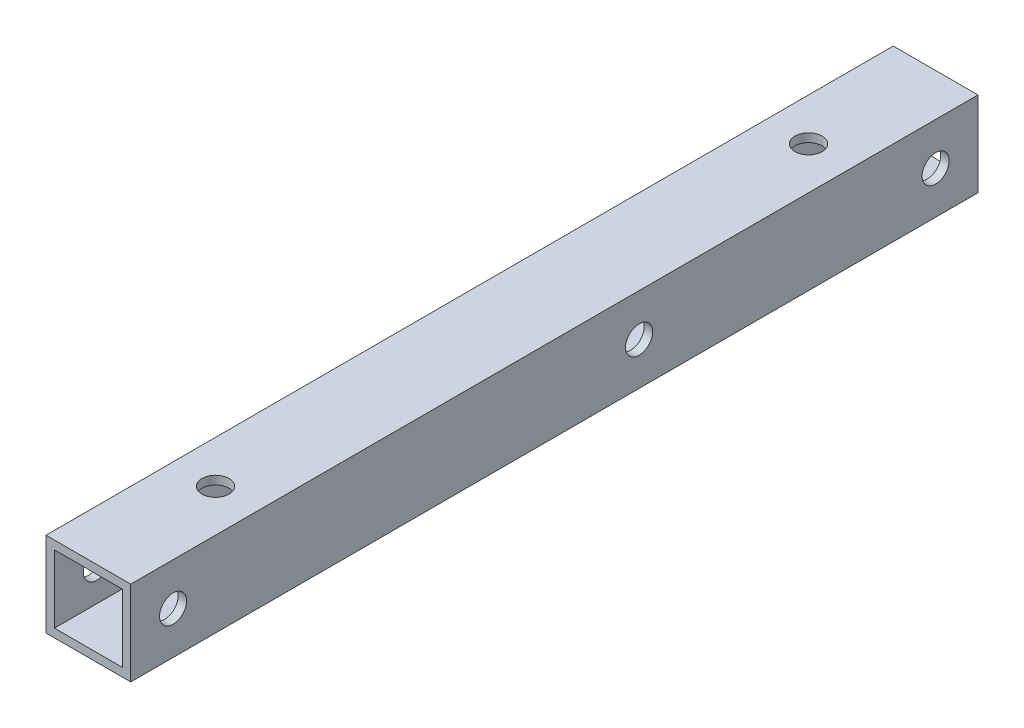
ISO-10303-21;
HEADER;
FILE_DESCRIPTION(('STEP AP214'),'2;1');
FILE_NAME('part.step','',(''),(''),'','','');
FILE_SCHEMA(('AUTOMOTIVE_DESIGN { 1 0 10303 214 1 1 1 1 }'));
ENDSEC;
DATA;
#1=APPLICATION_CONTEXT('core data for automotive mechanical design processes');
#2=APPLICATION_PROTOCOL_DEFINITION('international standard','automotive_design',2000,#1);
#3=PRODUCT_CONTEXT('',#1,'mechanical');
#4=PRODUCT('Part','Part','',(#3));
#5=PRODUCT_RELATED_PRODUCT_CATEGORY('part','',(#4));
#6=PRODUCT_DEFINITION_FORMATION('','',#4);
#7=PRODUCT_DEFINITION_CONTEXT('part definition',#1,'design');
#8=PRODUCT_DEFINITION('design','',#6,#7);
#9=PRODUCT_DEFINITION_SHAPE('','',#8);
#10=(LENGTH_UNIT() NAMED_UNIT(*) SI_UNIT(.MILLI.,.METRE.));
#11=(NAMED_UNIT(*) PLANE_ANGLE_UNIT() SI_UNIT($,.RADIAN.));
#12=(NAMED_UNIT(*) SI_UNIT($,.STERADIAN.) SOLID_ANGLE_UNIT());
#13=UNCERTAINTY_MEASURE_WITH_UNIT(LENGTH_MEASURE(1.E-05),#10,'distance_accuracy_value','');
#14=(GEOMETRIC_REPRESENTATION_CONTEXT(3) GLOBAL_UNCERTAINTY_ASSIGNED_CONTEXT((#13)) GLOBAL_UNIT_ASSIGNED_CONTEXT((#10,
#11,#12)) REPRESENTATION_CONTEXT('',''));
#15=CARTESIAN_POINT('',(0.,0.,0.));
#16=DIRECTION('',(0.,0.,1.));
#17=DIRECTION('',(1.,0.,0.));
#18=AXIS2_PLACEMENT_3D('',#15,#16,#17);
#19=CARTESIAN_POINT('',(0.,0.,100.));
#20=DIRECTION('',(0.,0.,1.));
#21=DIRECTION('',(1.,0.,0.));
#22=AXIS2_PLACEMENT_3D('',#19,#20,#21);
#23=PLANE('',#22);
#24=DIRECTION('',(0.,-1.,0.));
#25=VECTOR('',#24,1.);
#26=CARTESIAN_POINT('',(-5.,5.,100.));
#27=LINE('',#26,#25);
#28=CARTESIAN_POINT('',(-5.,5.,100.));
#29=VERTEX_POINT('',#28);
#30=CARTESIAN_POINT('',(-5.,-5.,100.));
#31=VERTEX_POINT('',#30);
#32=EDGE_CURVE('E164',#29,#31,#27,.T.);
#33=ORIENTED_EDGE('',*,*,#32,.T.);
#34=DIRECTION('',(1.,0.,0.));
#35=VECTOR('',#34,1.);
#36=CARTESIAN_POINT('',(5.,-5.,100.));
#37=LINE('',#36,#35);
#38=CARTESIAN_POINT('',(5.,-5.,100.));
#39=VERTEX_POINT('',#38);
#40=EDGE_CURVE('E167',#31,#39,#37,.T.);
#41=ORIENTED_EDGE('',*,*,#40,.T.);
#42=DIRECTION('',(0.,1.,0.));
#43=VECTOR('',#42,1.);
#44=CARTESIAN_POINT('',(5.,5.,100.));
#45=LINE('',#44,#43);
#46=CARTESIAN_POINT('',(5.,5.,100.));
#47=VERTEX_POINT('',#46);
#48=EDGE_CURVE('E170',#39,#47,#45,.T.);
#49=ORIENTED_EDGE('',*,*,#48,.T.);
#50=DIRECTION('',(-1.,0.,0.));
#51=VECTOR('',#50,1.);
#52=CARTESIAN_POINT('',(5.,5.,100.));
#53=LINE('',#52,#51);
#54=EDGE_CURVE('E172',#47,#29,#53,.T.);
#55=ORIENTED_EDGE('',*,*,#54,.T.);
#56=EDGE_LOOP('',(#33,#41,#49,#55));
#57=FACE_BOUND('',#56,.T.);
#58=DIRECTION('',(1.,0.,0.));
#59=VECTOR('',#58,1.);
#60=CARTESIAN_POINT('',(0.,-4.,100.));
#61=LINE('',#60,#59);
#62=CARTESIAN_POINT('',(-4.,-4.,100.));
#63=VERTEX_POINT('',#62);
#64=CARTESIAN_POINT('',(4.,-4.,100.));
#65=VERTEX_POINT('',#64);
#66=EDGE_CURVE('E134',#63,#65,#61,.T.);
#67=ORIENTED_EDGE('',*,*,#66,.F.);
#68=DIRECTION('',(0.,-1.,0.));
#69=VECTOR('',#68,1.);
#70=CARTESIAN_POINT('',(-4.,0.,100.));
#71=LINE('',#70,#69);
#72=CARTESIAN_POINT('',(-4.,4.,100.));
#73=VERTEX_POINT('',#72);
#74=EDGE_CURVE('E126',#73,#63,#71,.T.);
#75=ORIENTED_EDGE('',*,*,#74,.F.);
#76=DIRECTION('',(-1.,0.,0.));
#77=VECTOR('',#76,1.);
#78=CARTESIAN_POINT('',(0.,4.,100.));
#79=LINE('',#78,#77);
#80=CARTESIAN_POINT('',(4.,4.,100.));
#81=VERTEX_POINT('',#80);
#82=EDGE_CURVE('E148',#81,#73,#79,.T.);
#83=ORIENTED_EDGE('',*,*,#82,.F.);
#84=DIRECTION('',(0.,1.,0.));
#85=VECTOR('',#84,1.);
#86=CARTESIAN_POINT('',(4.,0.,100.));
#87=LINE('',#86,#85);
#88=EDGE_CURVE('E146',#65,#81,#87,.T.);
#89=ORIENTED_EDGE('',*,*,#88,.F.);
#90=EDGE_LOOP('',(#67,#75,#83,#89));
#91=FACE_BOUND('',#90,.T.);
#92=ADVANCED_FACE('F59',(#57,#91),#23,.T.);
#93=CARTESIAN_POINT('',(0.,0.,0.));
#94=DIRECTION('',(0.,0.,1.));
#95=DIRECTION('',(1.,0.,0.));
#96=AXIS2_PLACEMENT_3D('',#93,#94,#95);
#97=PLANE('',#96);
#98=DIRECTION('',(0.,-1.,0.));
#99=VECTOR('',#98,1.);
#100=CARTESIAN_POINT('',(-5.,5.,0.));
#101=LINE('',#100,#99);
#102=CARTESIAN_POINT('',(-5.,5.,0.));
#103=VERTEX_POINT('',#102);
#104=CARTESIAN_POINT('',(-5.,-5.,0.));
#105=VERTEX_POINT('',#104);
#106=EDGE_CURVE('E142',#103,#105,#101,.T.);
#107=ORIENTED_EDGE('',*,*,#106,.F.);
#108=DIRECTION('',(-1.,0.,0.));
#109=VECTOR('',#108,1.);
#110=CARTESIAN_POINT('',(5.,5.,0.));
#111=LINE('',#110,#109);
#112=CARTESIAN_POINT('',(5.,5.,0.));
#113=VERTEX_POINT('',#112);
#114=EDGE_CURVE('E168',#113,#103,#111,.T.);
#115=ORIENTED_EDGE('',*,*,#114,.F.);
#116=DIRECTION('',(0.,1.,0.));
#117=VECTOR('',#116,1.);
#118=CARTESIAN_POINT('',(5.,5.,0.));
#119=LINE('',#118,#117);
#120=CARTESIAN_POINT('',(5.,-5.,0.));
#121=VERTEX_POINT('',#120);
#122=EDGE_CURVE('E179',#121,#113,#119,.T.);
#123=ORIENTED_EDGE('',*,*,#122,.F.);
#124=DIRECTION('',(1.,0.,0.));
#125=VECTOR('',#124,1.);
#126=CARTESIAN_POINT('',(5.,-5.,0.));
#127=LINE('',#126,#125);
#128=EDGE_CURVE('E177',#105,#121,#127,.T.);
#129=ORIENTED_EDGE('',*,*,#128,.F.);
#130=EDGE_LOOP('',(#107,#115,#123,#129));
#131=FACE_BOUND('',#130,.T.);
#132=DIRECTION('',(0.,-1.,0.));
#133=VECTOR('',#132,1.);
#134=CARTESIAN_POINT('',(-4.,0.,0.));
#135=LINE('',#134,#133);
#136=CARTESIAN_POINT('',(-4.,4.,0.));
#137=VERTEX_POINT('',#136);
#138=CARTESIAN_POINT('',(-4.,-4.,0.));
#139=VERTEX_POINT('',#138);
#140=EDGE_CURVE('E84',#137,#139,#135,.T.);
#141=ORIENTED_EDGE('',*,*,#140,.T.);
#142=DIRECTION('',(1.,0.,0.));
#143=VECTOR('',#142,1.);
#144=CARTESIAN_POINT('',(0.,-4.,0.));
#145=LINE('',#144,#143);
#146=CARTESIAN_POINT('',(4.,-4.,0.));
#147=VERTEX_POINT('',#146);
#148=EDGE_CURVE('E141',#139,#147,#145,.T.);
#149=ORIENTED_EDGE('',*,*,#148,.T.);
#150=DIRECTION('',(0.,1.,0.));
#151=VECTOR('',#150,1.);
#152=CARTESIAN_POINT('',(4.,0.,0.));
#153=LINE('',#152,#151);
#154=CARTESIAN_POINT('',(4.,4.,0.));
#155=VERTEX_POINT('',#154);
#156=EDGE_CURVE('E156',#147,#155,#153,.T.);
#157=ORIENTED_EDGE('',*,*,#156,.T.);
#158=DIRECTION('',(-1.,0.,0.));
#159=VECTOR('',#158,1.);
#160=CARTESIAN_POINT('',(0.,4.,0.));
#161=LINE('',#160,#159);
#162=EDGE_CURVE('E135',#155,#137,#161,.T.);
#163=ORIENTED_EDGE('',*,*,#162,.T.);
#164=EDGE_LOOP('',(#141,#149,#157,#163));
#165=FACE_BOUND('',#164,.T.);
#166=ADVANCED_FACE('F265',(#131,#165),#97,.F.);
#167=CARTESIAN_POINT('',(-5.,5.,100.));
#168=DIRECTION('',(1.,0.,0.));
#169=DIRECTION('',(0.,1.,0.));
#170=AXIS2_PLACEMENT_3D('',#167,#168,#169);
#171=PLANE('',#170);
#172=CARTESIAN_POINT('',(-5.,0.,95.));
#173=DIRECTION('',(1.,0.,0.));
#174=DIRECTION('',(0.,1.,0.));
#175=AXIS2_PLACEMENT_3D('',#172,#173,#174);
#176=CIRCLE('',#175,1.60000000000001);
#177=CARTESIAN_POINT('',(-5.,1.6,95.));
#178=VERTEX_POINT('',#177);
#179=EDGE_CURVE('E193',#178,#178,#176,.T.);
#180=ORIENTED_EDGE('',*,*,#179,.T.);
#181=EDGE_LOOP('',(#180));
#182=FACE_BOUND('',#181,.T.);
#183=CARTESIAN_POINT('',(-5.,0.,40.));
#184=DIRECTION('',(1.,0.,0.));
#185=DIRECTION('',(0.,1.,0.));
#186=AXIS2_PLACEMENT_3D('',#183,#184,#185);
#187=CIRCLE('',#186,1.60000000000001);
#188=CARTESIAN_POINT('',(-5.,1.6,40.));
#189=VERTEX_POINT('',#188);
#190=EDGE_CURVE('E225',#189,#189,#187,.T.);
#191=ORIENTED_EDGE('',*,*,#190,.T.);
#192=EDGE_LOOP('',(#191));
#193=FACE_BOUND('',#192,.T.);
#194=CARTESIAN_POINT('',(-5.,0.,5.));
#195=DIRECTION('',(1.,0.,0.));
#196=DIRECTION('',(0.,-1.,0.));
#197=AXIS2_PLACEMENT_3D('',#194,#195,#196);
#198=CIRCLE('',#197,1.6);
#199=CARTESIAN_POINT('',(-5.,-1.6,5.));
#200=VERTEX_POINT('',#199);
#201=EDGE_CURVE('E231',#200,#200,#198,.T.);
#202=ORIENTED_EDGE('',*,*,#201,.T.);
#203=EDGE_LOOP('',(#202));
#204=FACE_BOUND('',#203,.T.);
#205=ORIENTED_EDGE('',*,*,#106,.T.);
#206=DIRECTION('',(0.,0.,-1.));
#207=VECTOR('',#206,1.);
#208=CARTESIAN_POINT('',(-5.,-5.,100.));
#209=LINE('',#208,#207);
#210=EDGE_CURVE('E12',#31,#105,#209,.T.);
#211=ORIENTED_EDGE('',*,*,#210,.F.);
#212=ORIENTED_EDGE('',*,*,#32,.F.);
#213=DIRECTION('',(0.,0.,-1.));
#214=VECTOR('',#213,1.);
#215=CARTESIAN_POINT('',(-5.,5.,100.));
#216=LINE('',#215,#214);
#217=EDGE_CURVE('E174',#29,#103,#216,.T.);
#218=ORIENTED_EDGE('',*,*,#217,.T.);
#219=EDGE_LOOP('',(#205,#211,#212,#218));
#220=FACE_BOUND('',#219,.T.);
#221=ADVANCED_FACE('F61',(#182,#193,#204,#220),#171,.F.);
#222=CARTESIAN_POINT('',(5.,-5.,100.));
#223=DIRECTION('',(0.,1.,0.));
#224=DIRECTION('',(-1.,0.,0.));
#225=AXIS2_PLACEMENT_3D('',#222,#223,#224);
#226=PLANE('',#225);
#227=CARTESIAN_POINT('',(0.,-5.00000000000001,85.));
#228=DIRECTION('',(0.,1.,0.));
#229=DIRECTION('',(-1.,0.,0.));
#230=AXIS2_PLACEMENT_3D('',#227,#228,#229);
#231=CIRCLE('',#230,1.60000000000001);
#232=CARTESIAN_POINT('',(-1.59999999999999,-5.00000000000001,85.));
#233=VERTEX_POINT('',#232);
#234=EDGE_CURVE('E343',#233,#233,#231,.T.);
#235=ORIENTED_EDGE('',*,*,#234,.T.);
#236=EDGE_LOOP('',(#235));
#237=FACE_BOUND('',#236,.T.);
#238=CARTESIAN_POINT('',(0.,-5.,15.));
#239=DIRECTION('',(0.,1.,0.));
#240=DIRECTION('',(-1.,0.,0.));
#241=AXIS2_PLACEMENT_3D('',#238,#239,#240);
#242=CIRCLE('',#241,1.6);
#243=CARTESIAN_POINT('',(-1.6,-5.,15.));
#244=VERTEX_POINT('',#243);
#245=EDGE_CURVE('E203',#244,#244,#242,.T.);
#246=ORIENTED_EDGE('',*,*,#245,.T.);
#247=EDGE_LOOP('',(#246));
#248=FACE_BOUND('',#247,.T.);
#249=ORIENTED_EDGE('',*,*,#128,.T.);
#250=DIRECTION('',(0.,0.,-1.));
#251=VECTOR('',#250,1.);
#252=CARTESIAN_POINT('',(5.,-5.,100.));
#253=LINE('',#252,#251);
#254=EDGE_CURVE('E68',#39,#121,#253,.T.);
#255=ORIENTED_EDGE('',*,*,#254,.F.);
#256=ORIENTED_EDGE('',*,*,#40,.F.);
#257=ORIENTED_EDGE('',*,*,#210,.T.);
#258=EDGE_LOOP('',(#249,#255,#256,#257));
#259=FACE_BOUND('',#258,.T.);
#260=ADVANCED_FACE('F264',(#237,#248,#259),#226,.F.);
#261=CARTESIAN_POINT('',(5.,5.,100.));
#262=DIRECTION('',(-1.,0.,0.));
#263=DIRECTION('',(0.,-1.,0.));
#264=AXIS2_PLACEMENT_3D('',#261,#262,#263);
#265=PLANE('',#264);
#266=CARTESIAN_POINT('',(5.,0.,95.));
#267=DIRECTION('',(1.,0.,0.));
#268=DIRECTION('',(0.,1.,0.));
#269=AXIS2_PLACEMENT_3D('',#266,#267,#268);
#270=CIRCLE('',#269,1.60000000000001);
#271=CARTESIAN_POINT('',(5.,1.60000000000001,95.));
#272=VERTEX_POINT('',#271);
#273=EDGE_CURVE('E222',#272,#272,#270,.T.);
#274=ORIENTED_EDGE('',*,*,#273,.F.);
#275=EDGE_LOOP('',(#274));
#276=FACE_BOUND('',#275,.T.);
#277=CARTESIAN_POINT('',(5.,0.,40.));
#278=DIRECTION('',(1.,0.,0.));
#279=DIRECTION('',(0.,1.,0.));
#280=AXIS2_PLACEMENT_3D('',#277,#278,#279);
#281=CIRCLE('',#280,1.60000000000001);
#282=CARTESIAN_POINT('',(5.,1.60000000000001,40.));
#283=VERTEX_POINT('',#282);
#284=EDGE_CURVE('E228',#283,#283,#281,.T.);
#285=ORIENTED_EDGE('',*,*,#284,.F.);
#286=EDGE_LOOP('',(#285));
#287=FACE_BOUND('',#286,.T.);
#288=CARTESIAN_POINT('',(5.,0.,5.));
#289=DIRECTION('',(1.,0.,0.));
#290=DIRECTION('',(0.,-1.,0.));
#291=AXIS2_PLACEMENT_3D('',#288,#289,#290);
#292=CIRCLE('',#291,1.6);
#293=CARTESIAN_POINT('',(5.,-1.6,5.));
#294=VERTEX_POINT('',#293);
#295=EDGE_CURVE('E207',#294,#294,#292,.T.);
#296=ORIENTED_EDGE('',*,*,#295,.F.);
#297=EDGE_LOOP('',(#296));
#298=FACE_BOUND('',#297,.T.);
#299=ORIENTED_EDGE('',*,*,#122,.T.);
#300=DIRECTION('',(0.,0.,-1.));
#301=VECTOR('',#300,1.);
#302=CARTESIAN_POINT('',(5.,5.,100.));
#303=LINE('',#302,#301);
#304=EDGE_CURVE('E184',#47,#113,#303,.T.);
#305=ORIENTED_EDGE('',*,*,#304,.F.);
#306=ORIENTED_EDGE('',*,*,#48,.F.);
#307=ORIENTED_EDGE('',*,*,#254,.T.);
#308=EDGE_LOOP('',(#299,#305,#306,#307));
#309=FACE_BOUND('',#308,.T.);
#310=ADVANCED_FACE('F283',(#276,#287,#298,#309),#265,.F.);
#311=CARTESIAN_POINT('',(5.,5.,100.));
#312=DIRECTION('',(0.,-1.,0.));
#313=DIRECTION('',(1.,0.,0.));
#314=AXIS2_PLACEMENT_3D('',#311,#312,#313);
#315=PLANE('',#314);
#316=CARTESIAN_POINT('',(0.,5.,85.));
#317=DIRECTION('',(0.,1.,0.));
#318=DIRECTION('',(-1.,0.,0.));
#319=AXIS2_PLACEMENT_3D('',#316,#317,#318);
#320=CIRCLE('',#319,1.60000000000001);
#321=CARTESIAN_POINT('',(-1.6,5.,85.));
#322=VERTEX_POINT('',#321);
#323=EDGE_CURVE('E342',#322,#322,#320,.T.);
#324=ORIENTED_EDGE('',*,*,#323,.F.);
#325=EDGE_LOOP('',(#324));
#326=FACE_BOUND('',#325,.T.);
#327=CARTESIAN_POINT('',(0.,5.,15.));
#328=DIRECTION('',(0.,1.,0.));
#329=DIRECTION('',(-1.,0.,0.));
#330=AXIS2_PLACEMENT_3D('',#327,#328,#329);
#331=CIRCLE('',#330,1.6);
#332=CARTESIAN_POINT('',(-1.6,5.,15.));
#333=VERTEX_POINT('',#332);
#334=EDGE_CURVE('E210',#333,#333,#331,.T.);
#335=ORIENTED_EDGE('',*,*,#334,.F.);
#336=EDGE_LOOP('',(#335));
#337=FACE_BOUND('',#336,.T.);
#338=ORIENTED_EDGE('',*,*,#114,.T.);
#339=ORIENTED_EDGE('',*,*,#217,.F.);
#340=ORIENTED_EDGE('',*,*,#54,.F.);
#341=ORIENTED_EDGE('',*,*,#304,.T.);
#342=EDGE_LOOP('',(#338,#339,#340,#341));
#343=FACE_BOUND('',#342,.T.);
#344=ADVANCED_FACE('F247',(#326,#337,#343),#315,.F.);
#345=CARTESIAN_POINT('',(-4.,0.,100.));
#346=DIRECTION('',(1.,0.,0.));
#347=DIRECTION('',(0.,1.,0.));
#348=AXIS2_PLACEMENT_3D('',#345,#346,#347);
#349=PLANE('',#348);
#350=CARTESIAN_POINT('',(-4.,0.,95.));
#351=DIRECTION('',(1.,0.,0.));
#352=DIRECTION('',(0.,1.,0.));
#353=AXIS2_PLACEMENT_3D('',#350,#351,#352);
#354=CIRCLE('',#353,1.60000000000001);
#355=CARTESIAN_POINT('',(-4.,1.6,95.));
#356=VERTEX_POINT('',#355);
#357=EDGE_CURVE('E154',#356,#356,#354,.T.);
#358=ORIENTED_EDGE('',*,*,#357,.F.);
#359=EDGE_LOOP('',(#358));
#360=FACE_BOUND('',#359,.T.);
#361=CARTESIAN_POINT('',(-4.,0.,40.));
#362=DIRECTION('',(1.,0.,0.));
#363=DIRECTION('',(0.,1.,0.));
#364=AXIS2_PLACEMENT_3D('',#361,#362,#363);
#365=CIRCLE('',#364,1.60000000000001);
#366=CARTESIAN_POINT('',(-4.,1.6,40.));
#367=VERTEX_POINT('',#366);
#368=EDGE_CURVE('E197',#367,#367,#365,.T.);
#369=ORIENTED_EDGE('',*,*,#368,.F.);
#370=EDGE_LOOP('',(#369));
#371=FACE_BOUND('',#370,.T.);
#372=CARTESIAN_POINT('',(-4.,0.,5.));
#373=DIRECTION('',(1.,0.,0.));
#374=DIRECTION('',(0.,1.,0.));
#375=AXIS2_PLACEMENT_3D('',#372,#373,#374);
#376=CIRCLE('',#375,1.6);
#377=CARTESIAN_POINT('',(-4.,1.6,5.));
#378=VERTEX_POINT('',#377);
#379=EDGE_CURVE('E192',#378,#378,#376,.T.);
#380=ORIENTED_EDGE('',*,*,#379,.F.);
#381=EDGE_LOOP('',(#380));
#382=FACE_BOUND('',#381,.T.);
#383=ORIENTED_EDGE('',*,*,#140,.F.);
#384=DIRECTION('',(0.,0.,-1.));
#385=VECTOR('',#384,1.);
#386=CARTESIAN_POINT('',(-4.,4.,100.));
#387=LINE('',#386,#385);
#388=EDGE_CURVE('E130',#73,#137,#387,.T.);
#389=ORIENTED_EDGE('',*,*,#388,.F.);
#390=ORIENTED_EDGE('',*,*,#74,.T.);
#391=DIRECTION('',(0.,0.,-1.));
#392=VECTOR('',#391,1.);
#393=CARTESIAN_POINT('',(-4.,-4.,100.));
#394=LINE('',#393,#392);
#395=EDGE_CURVE('E129',#63,#139,#394,.T.);
#396=ORIENTED_EDGE('',*,*,#395,.T.);
#397=EDGE_LOOP('',(#383,#389,#390,#396));
#398=FACE_BOUND('',#397,.T.);
#399=ADVANCED_FACE('F128',(#360,#371,#382,#398),#349,.T.);
#400=CARTESIAN_POINT('',(0.,-4.,100.));
#401=DIRECTION('',(0.,1.,0.));
#402=DIRECTION('',(-1.,0.,0.));
#403=AXIS2_PLACEMENT_3D('',#400,#401,#402);
#404=PLANE('',#403);
#405=CARTESIAN_POINT('',(0.,-4.,85.));
#406=DIRECTION('',(0.,1.,0.));
#407=DIRECTION('',(-1.,0.,0.));
#408=AXIS2_PLACEMENT_3D('',#405,#406,#407);
#409=CIRCLE('',#408,1.60000000000001);
#410=CARTESIAN_POINT('',(-1.59999999999999,-4.,85.));
#411=VERTEX_POINT('',#410);
#412=EDGE_CURVE('E215',#411,#411,#409,.T.);
#413=ORIENTED_EDGE('',*,*,#412,.F.);
#414=EDGE_LOOP('',(#413));
#415=FACE_BOUND('',#414,.T.);
#416=CARTESIAN_POINT('',(0.,-4.,15.));
#417=DIRECTION('',(0.,1.,0.));
#418=DIRECTION('',(-1.,0.,0.));
#419=AXIS2_PLACEMENT_3D('',#416,#417,#418);
#420=CIRCLE('',#419,1.6);
#421=CARTESIAN_POINT('',(-1.6,-4.,15.));
#422=VERTEX_POINT('',#421);
#423=EDGE_CURVE('E202',#422,#422,#420,.T.);
#424=ORIENTED_EDGE('',*,*,#423,.F.);
#425=EDGE_LOOP('',(#424));
#426=FACE_BOUND('',#425,.T.);
#427=ORIENTED_EDGE('',*,*,#148,.F.);
#428=ORIENTED_EDGE('',*,*,#395,.F.);
#429=ORIENTED_EDGE('',*,*,#66,.T.);
#430=DIRECTION('',(0.,0.,-1.));
#431=VECTOR('',#430,1.);
#432=CARTESIAN_POINT('',(4.,-4.,100.));
#433=LINE('',#432,#431);
#434=EDGE_CURVE('E143',#65,#147,#433,.T.);
#435=ORIENTED_EDGE('',*,*,#434,.T.);
#436=EDGE_LOOP('',(#427,#428,#429,#435));
#437=FACE_BOUND('',#436,.T.);
#438=ADVANCED_FACE('F138',(#415,#426,#437),#404,.T.);
#439=CARTESIAN_POINT('',(4.,0.,100.));
#440=DIRECTION('',(-1.,0.,0.));
#441=DIRECTION('',(0.,-1.,0.));
#442=AXIS2_PLACEMENT_3D('',#439,#440,#441);
#443=PLANE('',#442);
#444=CARTESIAN_POINT('',(4.,0.,95.));
#445=DIRECTION('',(-1.,0.,0.));
#446=DIRECTION('',(0.,-1.,0.));
#447=AXIS2_PLACEMENT_3D('',#444,#445,#446);
#448=CIRCLE('',#447,1.60000000000001);
#449=CARTESIAN_POINT('',(4.,-1.6,95.));
#450=VERTEX_POINT('',#449);
#451=EDGE_CURVE('E198',#450,#450,#448,.T.);
#452=ORIENTED_EDGE('',*,*,#451,.F.);
#453=EDGE_LOOP('',(#452));
#454=FACE_BOUND('',#453,.T.);
#455=CARTESIAN_POINT('',(4.,0.,40.));
#456=DIRECTION('',(-1.,0.,0.));
#457=DIRECTION('',(0.,-1.,0.));
#458=AXIS2_PLACEMENT_3D('',#455,#456,#457);
#459=CIRCLE('',#458,1.60000000000001);
#460=CARTESIAN_POINT('',(4.,-1.6,40.));
#461=VERTEX_POINT('',#460);
#462=EDGE_CURVE('E194',#461,#461,#459,.T.);
#463=ORIENTED_EDGE('',*,*,#462,.F.);
#464=EDGE_LOOP('',(#463));
#465=FACE_BOUND('',#464,.T.);
#466=CARTESIAN_POINT('',(4.,0.,5.));
#467=DIRECTION('',(-1.,0.,0.));
#468=DIRECTION('',(0.,-1.,0.));
#469=AXIS2_PLACEMENT_3D('',#466,#467,#468);
#470=CIRCLE('',#469,1.6);
#471=CARTESIAN_POINT('',(4.,-1.6,5.));
#472=VERTEX_POINT('',#471);
#473=EDGE_CURVE('E189',#472,#472,#470,.T.);
#474=ORIENTED_EDGE('',*,*,#473,.F.);
#475=EDGE_LOOP('',(#474));
#476=FACE_BOUND('',#475,.T.);
#477=ORIENTED_EDGE('',*,*,#156,.F.);
#478=ORIENTED_EDGE('',*,*,#434,.F.);
#479=ORIENTED_EDGE('',*,*,#88,.T.);
#480=DIRECTION('',(0.,0.,-1.));
#481=VECTOR('',#480,1.);
#482=CARTESIAN_POINT('',(4.,4.,100.));
#483=LINE('',#482,#481);
#484=EDGE_CURVE('E76',#81,#155,#483,.T.);
#485=ORIENTED_EDGE('',*,*,#484,.T.);
#486=EDGE_LOOP('',(#477,#478,#479,#485));
#487=FACE_BOUND('',#486,.T.);
#488=ADVANCED_FACE('F305',(#454,#465,#476,#487),#443,.T.);
#489=CARTESIAN_POINT('',(0.,4.,100.));
#490=DIRECTION('',(0.,-1.,0.));
#491=DIRECTION('',(1.,0.,0.));
#492=AXIS2_PLACEMENT_3D('',#489,#490,#491);
#493=PLANE('',#492);
#494=CARTESIAN_POINT('',(0.,4.,85.));
#495=DIRECTION('',(0.,-1.,0.));
#496=DIRECTION('',(1.,0.,0.));
#497=AXIS2_PLACEMENT_3D('',#494,#495,#496);
#498=CIRCLE('',#497,1.60000000000001);
#499=CARTESIAN_POINT('',(1.60000000000002,4.,85.));
#500=VERTEX_POINT('',#499);
#501=EDGE_CURVE('E63',#500,#500,#498,.T.);
#502=ORIENTED_EDGE('',*,*,#501,.F.);
#503=EDGE_LOOP('',(#502));
#504=FACE_BOUND('',#503,.T.);
#505=CARTESIAN_POINT('',(0.,4.,15.));
#506=DIRECTION('',(0.,-1.,0.));
#507=DIRECTION('',(1.,0.,0.));
#508=AXIS2_PLACEMENT_3D('',#505,#506,#507);
#509=CIRCLE('',#508,1.6);
#510=CARTESIAN_POINT('',(-1.6,4.,15.));
#511=VERTEX_POINT('',#510);
#512=EDGE_CURVE('E200',#511,#511,#509,.T.);
#513=ORIENTED_EDGE('',*,*,#512,.F.);
#514=EDGE_LOOP('',(#513));
#515=FACE_BOUND('',#514,.T.);
#516=ORIENTED_EDGE('',*,*,#162,.F.);
#517=ORIENTED_EDGE('',*,*,#484,.F.);
#518=ORIENTED_EDGE('',*,*,#82,.T.);
#519=ORIENTED_EDGE('',*,*,#388,.T.);
#520=EDGE_LOOP('',(#516,#517,#518,#519));
#521=FACE_BOUND('',#520,.T.);
#522=ADVANCED_FACE('F309',(#504,#515,#521),#493,.T.);
#523=CARTESIAN_POINT('',(-5.,0.,5.));
#524=DIRECTION('',(1.,0.,0.));
#525=DIRECTION('',(0.,1.,0.));
#526=AXIS2_PLACEMENT_3D('',#523,#524,#525);
#527=CYLINDRICAL_SURFACE('',#526,1.6);
#528=ORIENTED_EDGE('',*,*,#473,.T.);
#529=EDGE_LOOP('',(#528));
#530=FACE_BOUND('',#529,.T.);
#531=ORIENTED_EDGE('',*,*,#295,.T.);
#532=EDGE_LOOP('',(#531));
#533=FACE_BOUND('',#532,.T.);
#534=ADVANCED_FACE('F259',(#530,#533),#527,.F.);
#535=CARTESIAN_POINT('',(-5.,0.,40.));
#536=DIRECTION('',(1.,0.,0.));
#537=DIRECTION('',(0.,1.,0.));
#538=AXIS2_PLACEMENT_3D('',#535,#536,#537);
#539=CYLINDRICAL_SURFACE('',#538,1.60000000000001);
#540=ORIENTED_EDGE('',*,*,#462,.T.);
#541=EDGE_LOOP('',(#540));
#542=FACE_BOUND('',#541,.T.);
#543=ORIENTED_EDGE('',*,*,#284,.T.);
#544=EDGE_LOOP('',(#543));
#545=FACE_BOUND('',#544,.T.);
#546=ADVANCED_FACE('F315',(#542,#545),#539,.F.);
#547=CARTESIAN_POINT('',(-5.,0.,95.));
#548=DIRECTION('',(1.,0.,0.));
#549=DIRECTION('',(0.,1.,0.));
#550=AXIS2_PLACEMENT_3D('',#547,#548,#549);
#551=CYLINDRICAL_SURFACE('',#550,1.60000000000001);
#552=ORIENTED_EDGE('',*,*,#451,.T.);
#553=EDGE_LOOP('',(#552));
#554=FACE_BOUND('',#553,.T.);
#555=ORIENTED_EDGE('',*,*,#273,.T.);
#556=EDGE_LOOP('',(#555));
#557=FACE_BOUND('',#556,.T.);
#558=ADVANCED_FACE('F257',(#554,#557),#551,.F.);
#559=ORIENTED_EDGE('',*,*,#379,.T.);
#560=EDGE_LOOP('',(#559));
#561=FACE_BOUND('',#560,.T.);
#562=ORIENTED_EDGE('',*,*,#201,.F.);
#563=EDGE_LOOP('',(#562));
#564=FACE_BOUND('',#563,.T.);
#565=ADVANCED_FACE('F253',(#561,#564),#527,.F.);
#566=ORIENTED_EDGE('',*,*,#368,.T.);
#567=EDGE_LOOP('',(#566));
#568=FACE_BOUND('',#567,.T.);
#569=ORIENTED_EDGE('',*,*,#190,.F.);
#570=EDGE_LOOP('',(#569));
#571=FACE_BOUND('',#570,.T.);
#572=ADVANCED_FACE('F256',(#568,#571),#539,.F.);
#573=ORIENTED_EDGE('',*,*,#357,.T.);
#574=EDGE_LOOP('',(#573));
#575=FACE_BOUND('',#574,.T.);
#576=ORIENTED_EDGE('',*,*,#179,.F.);
#577=EDGE_LOOP('',(#576));
#578=FACE_BOUND('',#577,.T.);
#579=ADVANCED_FACE('F242',(#575,#578),#551,.F.);
#580=CARTESIAN_POINT('',(0.,-5.,15.));
#581=DIRECTION('',(0.,1.,0.));
#582=DIRECTION('',(-1.,0.,0.));
#583=AXIS2_PLACEMENT_3D('',#580,#581,#582);
#584=CYLINDRICAL_SURFACE('',#583,1.6);
#585=CARTESIAN_POINT('',(-1.6,4.,15.));
#586=CARTESIAN_POINT('',(-1.6,4.01041666666667,15.));
#587=CARTESIAN_POINT('',(-1.6,4.02083333333333,15.));
#588=CARTESIAN_POINT('',(-1.6,4.04166666666667,15.));
#589=CARTESIAN_POINT('',(-1.6,4.05208333333333,15.));
#590=CARTESIAN_POINT('',(-1.6,4.07291666666667,15.));
#591=CARTESIAN_POINT('',(-1.6,4.08333333333333,15.));
#592=CARTESIAN_POINT('',(-1.6,4.10416666666667,15.));
#593=CARTESIAN_POINT('',(-1.6,4.11458333333333,15.));
#594=CARTESIAN_POINT('',(-1.6,4.13541666666667,15.));
#595=CARTESIAN_POINT('',(-1.6,4.14583333333333,15.));
#596=CARTESIAN_POINT('',(-1.6,4.16666666666667,15.));
#597=CARTESIAN_POINT('',(-1.6,4.17708333333333,15.));
#598=CARTESIAN_POINT('',(-1.6,4.19791666666667,15.));
#599=CARTESIAN_POINT('',(-1.6,4.20833333333333,15.));
#600=CARTESIAN_POINT('',(-1.6,4.22916666666667,15.));
#601=CARTESIAN_POINT('',(-1.6,4.23958333333333,15.));
#602=CARTESIAN_POINT('',(-1.6,4.26041666666667,15.));
#603=CARTESIAN_POINT('',(-1.6,4.27083333333333,15.));
#604=CARTESIAN_POINT('',(-1.6,4.29166666666667,15.));
#605=CARTESIAN_POINT('',(-1.6,4.30208333333333,15.));
#606=CARTESIAN_POINT('',(-1.6,4.32291666666667,15.));
#607=CARTESIAN_POINT('',(-1.6,4.33333333333333,15.));
#608=CARTESIAN_POINT('',(-1.6,4.35416666666667,15.));
#609=CARTESIAN_POINT('',(-1.6,4.36458333333333,15.));
#610=CARTESIAN_POINT('',(-1.6,4.38541666666667,15.));
#611=CARTESIAN_POINT('',(-1.6,4.39583333333333,15.));
#612=CARTESIAN_POINT('',(-1.6,4.41666666666667,15.));
#613=CARTESIAN_POINT('',(-1.6,4.42708333333333,15.));
#614=CARTESIAN_POINT('',(-1.6,4.44791666666667,15.));
#615=CARTESIAN_POINT('',(-1.6,4.45833333333333,15.));
#616=CARTESIAN_POINT('',(-1.6,4.47916666666667,15.));
#617=CARTESIAN_POINT('',(-1.6,4.48958333333333,15.));
#618=CARTESIAN_POINT('',(-1.6,4.51041666666667,15.));
#619=CARTESIAN_POINT('',(-1.6,4.52083333333333,15.));
#620=CARTESIAN_POINT('',(-1.6,4.54166666666667,15.));
#621=CARTESIAN_POINT('',(-1.6,4.55208333333333,15.));
#622=CARTESIAN_POINT('',(-1.6,4.57291666666667,15.));
#623=CARTESIAN_POINT('',(-1.6,4.58333333333333,15.));
#624=CARTESIAN_POINT('',(-1.6,4.60416666666667,15.));
#625=CARTESIAN_POINT('',(-1.6,4.61458333333333,15.));
#626=CARTESIAN_POINT('',(-1.6,4.63541666666667,15.));
#627=CARTESIAN_POINT('',(-1.6,4.64583333333333,15.));
#628=CARTESIAN_POINT('',(-1.6,4.66666666666667,15.));
#629=CARTESIAN_POINT('',(-1.6,4.67708333333333,15.));
#630=CARTESIAN_POINT('',(-1.6,4.69791666666667,15.));
#631=CARTESIAN_POINT('',(-1.6,4.70833333333333,15.));
#632=CARTESIAN_POINT('',(-1.6,4.72916666666667,15.));
#633=CARTESIAN_POINT('',(-1.6,4.73958333333333,15.));
#634=CARTESIAN_POINT('',(-1.6,4.76041666666667,15.));
#635=CARTESIAN_POINT('',(-1.6,4.77083333333333,15.));
#636=CARTESIAN_POINT('',(-1.6,4.79166666666667,15.));
#637=CARTESIAN_POINT('',(-1.6,4.80208333333333,15.));
#638=CARTESIAN_POINT('',(-1.6,4.82291666666667,15.));
#639=CARTESIAN_POINT('',(-1.6,4.83333333333333,15.));
#640=CARTESIAN_POINT('',(-1.6,4.85416666666667,15.));
#641=CARTESIAN_POINT('',(-1.6,4.86458333333333,15.));
#642=CARTESIAN_POINT('',(-1.6,4.88541666666667,15.));
#643=CARTESIAN_POINT('',(-1.6,4.89583333333333,15.));
#644=CARTESIAN_POINT('',(-1.6,4.91666666666667,15.));
#645=CARTESIAN_POINT('',(-1.6,4.92708333333333,15.));
#646=CARTESIAN_POINT('',(-1.6,4.94791666666667,15.));
#647=CARTESIAN_POINT('',(-1.6,4.95833333333333,15.));
#648=CARTESIAN_POINT('',(-1.6,4.97916666666667,15.));
#649=CARTESIAN_POINT('',(-1.6,4.98958333333333,15.));
#650=CARTESIAN_POINT('',(-1.6,5.,15.));
#651=B_SPLINE_CURVE_WITH_KNOTS('',3,(#585,#586,#587,#588,#589,#590,#591,#592,#593,#594,#595,
#596,#597,#598,#599,#600,#601,#602,#603,#604,#605,#606,#607,#608,#609,#610,#611,#612,#613,#614,
#615,#616,#617,#618,#619,#620,#621,#622,#623,#624,#625,#626,#627,#628,#629,#630,#631,#632,#633,
#634,#635,#636,#637,#638,#639,#640,#641,#642,#643,#644,#645,#646,#647,#648,#649,#650),
.UNSPECIFIED.,.F.,.F.,(4,2,2,2,2,2,2,2,2,2,2,2,2,2,2,2,2,2,2,2,2,2,2,2,2,2,2,2,2,2,2,2,4),(0.,
0.03125,0.0625000000000001,0.0937500000000001,0.125,0.15625,0.1875,0.21875,0.25,0.28125,0.3125,
0.34375,0.375,0.40625,0.4375,0.46875,0.5,0.53125,0.5625,0.593750000000001,0.625000000000001,
0.656250000000001,0.687500000000001,0.718750000000001,0.750000000000001,0.781250000000001,
0.812500000000001,0.843750000000001,0.875000000000001,0.906250000000001,0.937500000000001,
0.968750000000001,1.),.UNSPECIFIED.);
#652=EDGE_CURVE('BSEAM323',#511,#333,#651,.T.);
#653=ORIENTED_EDGE('',*,*,#512,.T.);
#654=ORIENTED_EDGE('',*,*,#334,.T.);
#655=ORIENTED_EDGE('',*,*,#652,.T.);
#656=ORIENTED_EDGE('',*,*,#652,.F.);
#657=EDGE_LOOP('',(#653,#655,#654,#656));
#658=FACE_BOUND('',#657,.T.);
#659=ADVANCED_FACE('F323',(#658),#584,.F.);
#660=CARTESIAN_POINT('',(-1.6,-4.,15.));
#661=CARTESIAN_POINT('',(-1.6,-4.01041666666667,15.));
#662=CARTESIAN_POINT('',(-1.6,-4.02083333333333,15.));
#663=CARTESIAN_POINT('',(-1.6,-4.04166666666667,15.));
#664=CARTESIAN_POINT('',(-1.6,-4.05208333333333,15.));
#665=CARTESIAN_POINT('',(-1.6,-4.07291666666667,15.));
#666=CARTESIAN_POINT('',(-1.6,-4.08333333333333,15.));
#667=CARTESIAN_POINT('',(-1.6,-4.10416666666667,15.));
#668=CARTESIAN_POINT('',(-1.6,-4.11458333333333,15.));
#669=CARTESIAN_POINT('',(-1.6,-4.13541666666667,15.));
#670=CARTESIAN_POINT('',(-1.6,-4.14583333333333,15.));
#671=CARTESIAN_POINT('',(-1.6,-4.16666666666667,15.));
#672=CARTESIAN_POINT('',(-1.6,-4.17708333333334,15.));
#673=CARTESIAN_POINT('',(-1.6,-4.19791666666667,15.));
#674=CARTESIAN_POINT('',(-1.6,-4.20833333333334,15.));
#675=CARTESIAN_POINT('',(-1.6,-4.22916666666667,15.));
#676=CARTESIAN_POINT('',(-1.6,-4.23958333333334,15.));
#677=CARTESIAN_POINT('',(-1.6,-4.26041666666667,15.));
#678=CARTESIAN_POINT('',(-1.6,-4.27083333333334,15.));
#679=CARTESIAN_POINT('',(-1.6,-4.29166666666667,15.));
#680=CARTESIAN_POINT('',(-1.6,-4.30208333333334,15.));
#681=CARTESIAN_POINT('',(-1.6,-4.32291666666667,15.));
#682=CARTESIAN_POINT('',(-1.6,-4.33333333333334,15.));
#683=CARTESIAN_POINT('',(-1.6,-4.35416666666667,15.));
#684=CARTESIAN_POINT('',(-1.6,-4.36458333333334,15.));
#685=CARTESIAN_POINT('',(-1.6,-4.38541666666667,15.));
#686=CARTESIAN_POINT('',(-1.6,-4.39583333333334,15.));
#687=CARTESIAN_POINT('',(-1.6,-4.41666666666667,15.));
#688=CARTESIAN_POINT('',(-1.6,-4.42708333333334,15.));
#689=CARTESIAN_POINT('',(-1.6,-4.44791666666667,15.));
#690=CARTESIAN_POINT('',(-1.6,-4.45833333333334,15.));
#691=CARTESIAN_POINT('',(-1.6,-4.47916666666667,15.));
#692=CARTESIAN_POINT('',(-1.6,-4.48958333333334,15.));
#693=CARTESIAN_POINT('',(-1.6,-4.51041666666667,15.));
#694=CARTESIAN_POINT('',(-1.6,-4.52083333333334,15.));
#695=CARTESIAN_POINT('',(-1.6,-4.54166666666667,15.));
#696=CARTESIAN_POINT('',(-1.6,-4.55208333333334,15.));
#697=CARTESIAN_POINT('',(-1.6,-4.57291666666667,15.));
#698=CARTESIAN_POINT('',(-1.6,-4.58333333333334,15.));
#699=CARTESIAN_POINT('',(-1.6,-4.60416666666667,15.));
#700=CARTESIAN_POINT('',(-1.6,-4.61458333333334,15.));
#701=CARTESIAN_POINT('',(-1.6,-4.63541666666667,15.));
#702=CARTESIAN_POINT('',(-1.6,-4.64583333333334,15.));
#703=CARTESIAN_POINT('',(-1.6,-4.66666666666667,15.));
#704=CARTESIAN_POINT('',(-1.6,-4.67708333333334,15.));
#705=CARTESIAN_POINT('',(-1.6,-4.69791666666667,15.));
#706=CARTESIAN_POINT('',(-1.6,-4.70833333333334,15.));
#707=CARTESIAN_POINT('',(-1.6,-4.72916666666667,15.));
#708=CARTESIAN_POINT('',(-1.6,-4.73958333333334,15.));
#709=CARTESIAN_POINT('',(-1.6,-4.76041666666667,15.));
#710=CARTESIAN_POINT('',(-1.6,-4.77083333333334,15.));
#711=CARTESIAN_POINT('',(-1.6,-4.79166666666667,15.));
#712=CARTESIAN_POINT('',(-1.6,-4.80208333333334,15.));
#713=CARTESIAN_POINT('',(-1.6,-4.82291666666667,15.));
#714=CARTESIAN_POINT('',(-1.6,-4.83333333333334,15.));
#715=CARTESIAN_POINT('',(-1.6,-4.85416666666667,15.));
#716=CARTESIAN_POINT('',(-1.6,-4.86458333333334,15.));
#717=CARTESIAN_POINT('',(-1.6,-4.88541666666667,15.));
#718=CARTESIAN_POINT('',(-1.6,-4.89583333333334,15.));
#719=CARTESIAN_POINT('',(-1.6,-4.91666666666667,15.));
#720=CARTESIAN_POINT('',(-1.6,-4.92708333333334,15.));
#721=CARTESIAN_POINT('',(-1.6,-4.94791666666667,15.));
#722=CARTESIAN_POINT('',(-1.6,-4.95833333333334,15.));
#723=CARTESIAN_POINT('',(-1.6,-4.97916666666667,15.));
#724=CARTESIAN_POINT('',(-1.6,-4.98958333333334,15.));
#725=CARTESIAN_POINT('',(-1.6,-5.,15.));
#726=B_SPLINE_CURVE_WITH_KNOTS('',3,(#660,#661,#662,#663,#664,#665,#666,#667,#668,#669,#670,
#671,#672,#673,#674,#675,#676,#677,#678,#679,#680,#681,#682,#683,#684,#685,#686,#687,#688,#689,
#690,#691,#692,#693,#694,#695,#696,#697,#698,#699,#700,#701,#702,#703,#704,#705,#706,#707,#708,
#709,#710,#711,#712,#713,#714,#715,#716,#717,#718,#719,#720,#721,#722,#723,#724,#725),
.UNSPECIFIED.,.F.,.F.,(4,2,2,2,2,2,2,2,2,2,2,2,2,2,2,2,2,2,2,2,2,2,2,2,2,2,2,2,2,2,2,2,4),(0.,
0.03125,0.0625000000000001,0.0937500000000001,0.125,0.156250000000001,0.187500000000001,
0.218750000000001,0.250000000000001,0.281250000000001,0.312500000000001,0.343750000000001,
0.375000000000001,0.406250000000001,0.437500000000001,0.468750000000001,0.500000000000001,
0.531250000000001,0.562500000000001,0.593750000000002,0.625000000000002,0.656250000000002,
0.687500000000002,0.718750000000002,0.750000000000002,0.781250000000002,0.812500000000002,
0.843750000000002,0.875000000000003,0.906250000000003,0.937500000000003,0.968750000000003,1.),.UNSPECIFIED.);
#727=EDGE_CURVE('BSEAM326',#422,#244,#726,.T.);
#728=ORIENTED_EDGE('',*,*,#423,.T.);
#729=ORIENTED_EDGE('',*,*,#245,.F.);
#730=ORIENTED_EDGE('',*,*,#727,.T.);
#731=ORIENTED_EDGE('',*,*,#727,.F.);
#732=EDGE_LOOP('',(#728,#730,#729,#731));
#733=FACE_BOUND('',#732,.T.);
#734=ADVANCED_FACE('F326',(#733),#584,.F.);
#735=CARTESIAN_POINT('',(0.,-5.00000000000001,85.));
#736=DIRECTION('',(0.,1.,0.));
#737=DIRECTION('',(-1.,0.,0.));
#738=AXIS2_PLACEMENT_3D('',#735,#736,#737);
#739=CYLINDRICAL_SURFACE('',#738,1.60000000000001);
#740=ORIENTED_EDGE('',*,*,#501,.T.);
#741=EDGE_LOOP('',(#740));
#742=FACE_BOUND('',#741,.T.);
#743=ORIENTED_EDGE('',*,*,#323,.T.);
#744=EDGE_LOOP('',(#743));
#745=FACE_BOUND('',#744,.T.);
#746=ADVANCED_FACE('F327',(#742,#745),#739,.F.);
#747=ORIENTED_EDGE('',*,*,#412,.T.);
#748=EDGE_LOOP('',(#747));
#749=FACE_BOUND('',#748,.T.);
#750=ORIENTED_EDGE('',*,*,#234,.F.);
#751=EDGE_LOOP('',(#750));
#752=FACE_BOUND('',#751,.T.);
#753=ADVANCED_FACE('F329',(#749,#752),#739,.F.);
#754=CLOSED_SHELL('',(#92,#166,#221,#260,#310,#344,#399,#438,#488,#522,#534,#546,#558,#565,#572,
#579,#659,#734,#746,#753));
#755=MANIFOLD_SOLID_BREP('B2',#754);
#756=ADVANCED_BREP_SHAPE_REPRESENTATION('',(#18,#755),#14);
#757=SHAPE_DEFINITION_REPRESENTATION(#9,#756);
ENDSEC;
END-ISO-10303-21;
